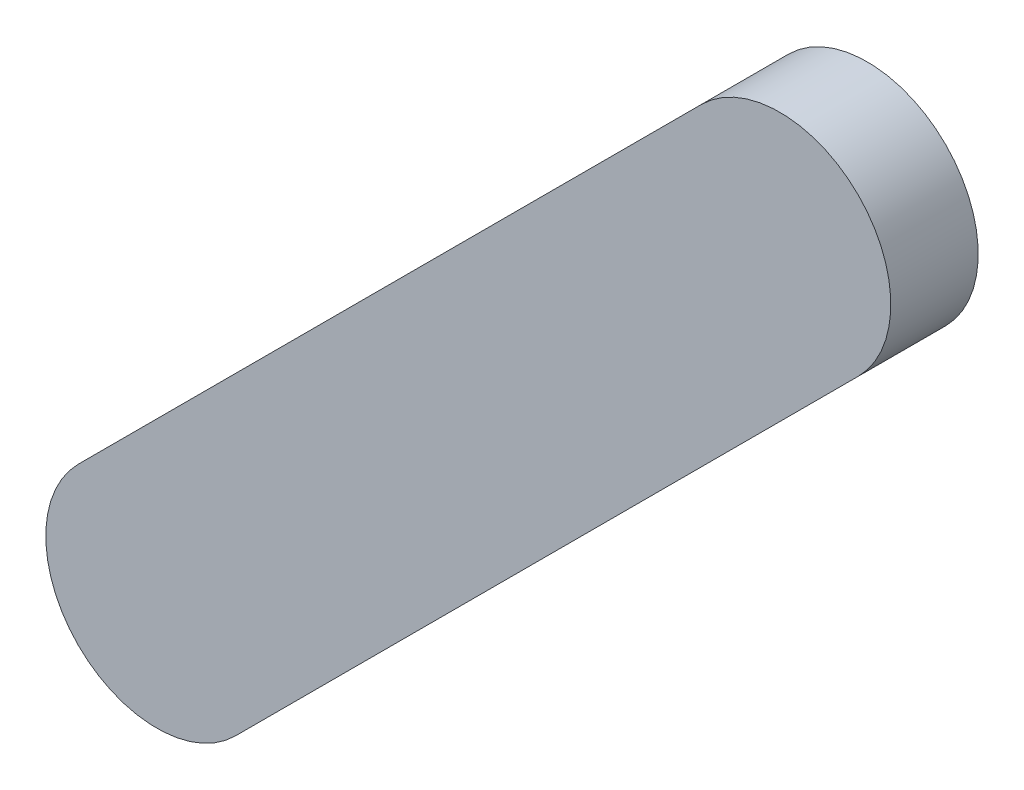
ISO-10303-21;
HEADER;
FILE_DESCRIPTION(('STEP AP214'),'2;1');
FILE_NAME('part.step','',(''),(''),'','','');
FILE_SCHEMA(('AUTOMOTIVE_DESIGN { 1 0 10303 214 1 1 1 1 }'));
ENDSEC;
DATA;
#1=APPLICATION_CONTEXT('core data for automotive mechanical design processes');
#2=APPLICATION_PROTOCOL_DEFINITION('international standard','automotive_design',2000,#1);
#3=PRODUCT_CONTEXT('',#1,'mechanical');
#4=PRODUCT('Part','Part','',(#3));
#5=PRODUCT_RELATED_PRODUCT_CATEGORY('part','',(#4));
#6=PRODUCT_DEFINITION_FORMATION('','',#4);
#7=PRODUCT_DEFINITION_CONTEXT('part definition',#1,'design');
#8=PRODUCT_DEFINITION('design','',#6,#7);
#9=PRODUCT_DEFINITION_SHAPE('','',#8);
#10=(LENGTH_UNIT() NAMED_UNIT(*) SI_UNIT(.MILLI.,.METRE.));
#11=(NAMED_UNIT(*) PLANE_ANGLE_UNIT() SI_UNIT($,.RADIAN.));
#12=(NAMED_UNIT(*) SI_UNIT($,.STERADIAN.) SOLID_ANGLE_UNIT());
#13=UNCERTAINTY_MEASURE_WITH_UNIT(LENGTH_MEASURE(1.E-05),#10,'distance_accuracy_value','');
#14=(GEOMETRIC_REPRESENTATION_CONTEXT(3) GLOBAL_UNCERTAINTY_ASSIGNED_CONTEXT((#13)) GLOBAL_UNIT_ASSIGNED_CONTEXT((#10,
#11,#12)) REPRESENTATION_CONTEXT('',''));
#15=CARTESIAN_POINT('',(0.,0.,0.));
#16=DIRECTION('',(0.,0.,1.));
#17=DIRECTION('',(1.,0.,0.));
#18=AXIS2_PLACEMENT_3D('',#15,#16,#17);
#19=CARTESIAN_POINT('',(109.4213966,53.23298472,0.));
#20=DIRECTION('',(-0.707107410934185,0.707106151438349,0.));
#21=DIRECTION('',(0.707106151438349,0.707107410934185,0.));
#22=AXIS2_PLACEMENT_3D('',#19,#20,#21);
#23=PLANE('',#22);
#24=DIRECTION('',(0.707106151438349,0.707107410934185,0.));
#25=VECTOR('',#24,1.);
#26=CARTESIAN_POINT('',(109.4213966,53.23298472,0.1999996));
#27=LINE('',#26,#25);
#28=CARTESIAN_POINT('',(109.4213966,53.23298472,0.1999996));
#29=VERTEX_POINT('',#28);
#30=CARTESIAN_POINT('',(110.8474034,54.65899406,0.1999996));
#31=VERTEX_POINT('',#30);
#32=EDGE_CURVE('E11',#29,#31,#27,.T.);
#33=ORIENTED_EDGE('',*,*,#32,.F.);
#34=DIRECTION('',(0.,0.,1.));
#35=VECTOR('',#34,1.);
#36=CARTESIAN_POINT('',(109.4213966,53.23298472,0.));
#37=LINE('',#36,#35);
#38=CARTESIAN_POINT('',(109.4213966,53.23298472,0.));
#39=VERTEX_POINT('',#38);
#40=EDGE_CURVE('E24',#39,#29,#37,.T.);
#41=ORIENTED_EDGE('',*,*,#40,.F.);
#42=DIRECTION('',(0.707106151438349,0.707107410934185,0.));
#43=VECTOR('',#42,1.);
#44=CARTESIAN_POINT('',(109.4213966,53.23298472,0.));
#45=LINE('',#44,#43);
#46=CARTESIAN_POINT('',(110.8474034,54.65899406,0.));
#47=VERTEX_POINT('',#46);
#48=EDGE_CURVE('E75',#39,#47,#45,.T.);
#49=ORIENTED_EDGE('',*,*,#48,.T.);
#50=DIRECTION('',(0.,0.,1.));
#51=VECTOR('',#50,1.);
#52=CARTESIAN_POINT('',(110.8474034,54.65899406,0.));
#53=LINE('',#52,#51);
#54=EDGE_CURVE('E37',#47,#31,#53,.T.);
#55=ORIENTED_EDGE('',*,*,#54,.T.);
#56=EDGE_LOOP('',(#33,#41,#49,#55));
#57=FACE_BOUND('',#56,.T.);
#58=ADVANCED_FACE('F17',(#57),#23,.F.);
#59=CARTESIAN_POINT('',(110.66779873,54.83859873,0.));
#60=DIRECTION('',(0.,0.,-1.));
#61=DIRECTION('',(0.707106781186576,-0.70710678118652,0.));
#62=AXIS2_PLACEMENT_3D('',#59,#60,#61);
#63=CYLINDRICAL_SURFACE('',#62,0.253999360179552);
#64=CARTESIAN_POINT('',(110.66779873,54.83859873,0.1999996));
#65=DIRECTION('',(0.,0.,1.));
#66=DIRECTION('',(0.707106781186576,-0.70710678118652,0.));
#67=AXIS2_PLACEMENT_3D('',#64,#65,#66);
#68=CIRCLE('',#67,0.253999360179552);
#69=CARTESIAN_POINT('',(110.48819406,55.0182034,0.1999996));
#70=VERTEX_POINT('',#69);
#71=EDGE_CURVE('E83',#31,#70,#68,.T.);
#72=ORIENTED_EDGE('',*,*,#71,.F.);
#73=ORIENTED_EDGE('',*,*,#54,.F.);
#74=CARTESIAN_POINT('',(110.66779873,54.83859873,0.));
#75=DIRECTION('',(0.,0.,1.));
#76=DIRECTION('',(0.707106781186576,-0.70710678118652,0.));
#77=AXIS2_PLACEMENT_3D('',#74,#75,#76);
#78=CIRCLE('',#77,0.253999360179552);
#79=CARTESIAN_POINT('',(110.48819406,55.0182034,0.));
#80=VERTEX_POINT('',#79);
#81=EDGE_CURVE('E81',#47,#80,#78,.T.);
#82=ORIENTED_EDGE('',*,*,#81,.T.);
#83=DIRECTION('',(0.,0.,1.));
#84=VECTOR('',#83,1.);
#85=CARTESIAN_POINT('',(110.48819406,55.0182034,0.));
#86=LINE('',#85,#84);
#87=EDGE_CURVE('E67',#80,#70,#86,.T.);
#88=ORIENTED_EDGE('',*,*,#87,.T.);
#89=EDGE_LOOP('',(#72,#73,#82,#88));
#90=FACE_BOUND('',#89,.T.);
#91=ADVANCED_FACE('F89',(#90),#63,.T.);
#92=CARTESIAN_POINT('',(110.48819406,55.0182034,0.));
#93=DIRECTION('',(0.707106151438351,-0.707107410934184,0.));
#94=DIRECTION('',(-0.707107410934184,-0.707106151438351,0.));
#95=AXIS2_PLACEMENT_3D('',#92,#93,#94);
#96=PLANE('',#95);
#97=DIRECTION('',(-0.707107410934184,-0.707106151438351,0.));
#98=VECTOR('',#97,1.);
#99=CARTESIAN_POINT('',(110.48819406,55.0182034,0.1999996));
#100=LINE('',#99,#98);
#101=CARTESIAN_POINT('',(109.06218472,53.5921966,0.1999996));
#102=VERTEX_POINT('',#101);
#103=EDGE_CURVE('E71',#70,#102,#100,.T.);
#104=ORIENTED_EDGE('',*,*,#103,.F.);
#105=ORIENTED_EDGE('',*,*,#87,.F.);
#106=DIRECTION('',(-0.707107410934184,-0.707106151438351,0.));
#107=VECTOR('',#106,1.);
#108=CARTESIAN_POINT('',(110.48819406,55.0182034,0.));
#109=LINE('',#108,#107);
#110=CARTESIAN_POINT('',(109.06218472,53.5921966,0.));
#111=VERTEX_POINT('',#110);
#112=EDGE_CURVE('E63',#80,#111,#109,.T.);
#113=ORIENTED_EDGE('',*,*,#112,.T.);
#114=DIRECTION('',(0.,0.,1.));
#115=VECTOR('',#114,1.);
#116=CARTESIAN_POINT('',(109.06218472,53.5921966,0.));
#117=LINE('',#116,#115);
#118=EDGE_CURVE('E53',#111,#102,#117,.T.);
#119=ORIENTED_EDGE('',*,*,#118,.T.);
#120=EDGE_LOOP('',(#104,#105,#113,#119));
#121=FACE_BOUND('',#120,.T.);
#122=ADVANCED_FACE('F66',(#121),#96,.F.);
#123=CARTESIAN_POINT('',(109.24179066,53.41259066,0.));
#124=DIRECTION('',(0.,0.,-1.));
#125=DIRECTION('',(-0.707106781186548,0.707106781186548,0.));
#126=AXIS2_PLACEMENT_3D('',#123,#124,#125);
#127=CYLINDRICAL_SURFACE('',#126,0.254001156230774);
#128=CARTESIAN_POINT('',(109.24179066,53.41259066,0.1999996));
#129=DIRECTION('',(0.,0.,1.));
#130=DIRECTION('',(-0.707106781186548,0.707106781186548,0.));
#131=AXIS2_PLACEMENT_3D('',#128,#129,#130);
#132=CIRCLE('',#131,0.254001156230774);
#133=EDGE_CURVE('E59',#102,#29,#132,.T.);
#134=ORIENTED_EDGE('',*,*,#133,.F.);
#135=ORIENTED_EDGE('',*,*,#118,.F.);
#136=CARTESIAN_POINT('',(109.24179066,53.41259066,0.));
#137=DIRECTION('',(0.,0.,1.));
#138=DIRECTION('',(-0.707106781186548,0.707106781186548,0.));
#139=AXIS2_PLACEMENT_3D('',#136,#137,#138);
#140=CIRCLE('',#139,0.254001156230774);
#141=EDGE_CURVE('E57',#111,#39,#140,.T.);
#142=ORIENTED_EDGE('',*,*,#141,.T.);
#143=ORIENTED_EDGE('',*,*,#40,.T.);
#144=EDGE_LOOP('',(#134,#135,#142,#143));
#145=FACE_BOUND('',#144,.T.);
#146=ADVANCED_FACE('F55',(#145),#127,.T.);
#147=CARTESIAN_POINT('',(109.4213966,53.23298472,0.));
#148=DIRECTION('',(0.,0.,-1.));
#149=DIRECTION('',(-1.,0.,0.));
#150=AXIS2_PLACEMENT_3D('',#147,#148,#149);
#151=PLANE('',#150);
#152=ORIENTED_EDGE('',*,*,#141,.F.);
#153=ORIENTED_EDGE('',*,*,#112,.F.);
#154=ORIENTED_EDGE('',*,*,#81,.F.);
#155=ORIENTED_EDGE('',*,*,#48,.F.);
#156=EDGE_LOOP('',(#152,#153,#154,#155));
#157=FACE_BOUND('',#156,.T.);
#158=ADVANCED_FACE('F74',(#157),#151,.T.);
#159=CARTESIAN_POINT('',(109.4213966,53.23298472,0.1999996));
#160=DIRECTION('',(0.,0.,-1.));
#161=DIRECTION('',(-1.,0.,0.));
#162=AXIS2_PLACEMENT_3D('',#159,#160,#161);
#163=PLANE('',#162);
#164=ORIENTED_EDGE('',*,*,#32,.T.);
#165=ORIENTED_EDGE('',*,*,#71,.T.);
#166=ORIENTED_EDGE('',*,*,#103,.T.);
#167=ORIENTED_EDGE('',*,*,#133,.T.);
#168=EDGE_LOOP('',(#164,#165,#166,#167));
#169=FACE_BOUND('',#168,.T.);
#170=ADVANCED_FACE('F91',(#169),#163,.F.);
#171=CLOSED_SHELL('',(#58,#91,#122,#146,#158,#170));
#172=MANIFOLD_SOLID_BREP('B1',#171);
#173=ADVANCED_BREP_SHAPE_REPRESENTATION('',(#18,#172),#14);
#174=SHAPE_DEFINITION_REPRESENTATION(#9,#173);
ENDSEC;
END-ISO-10303-21;
